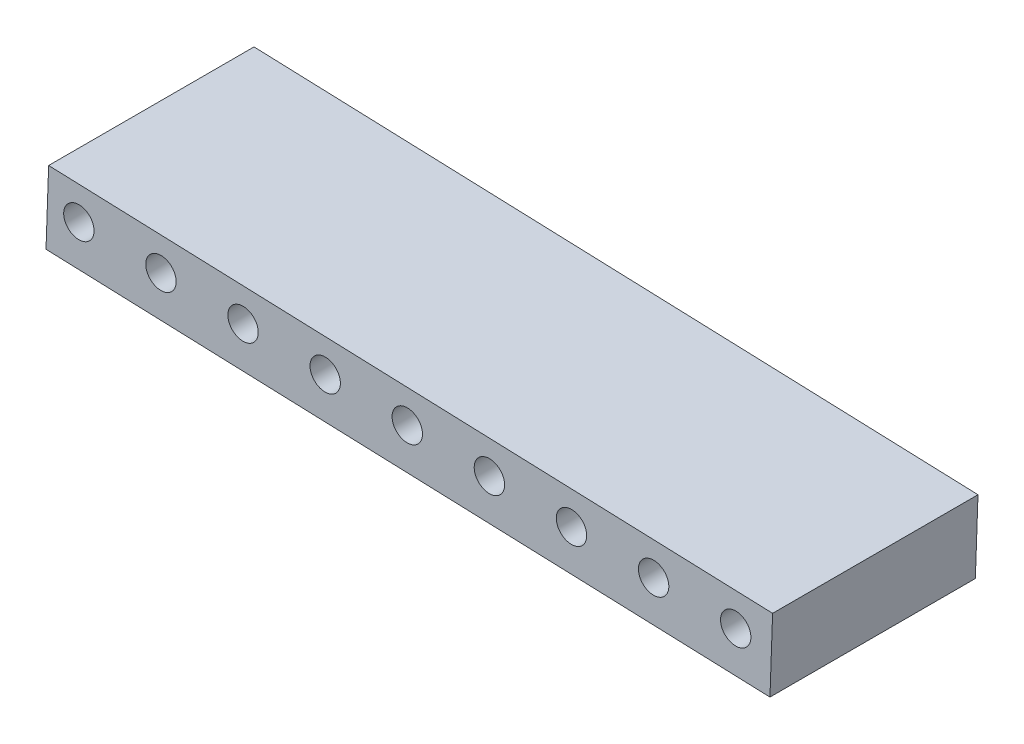
ISO-10303-21;
HEADER;
FILE_DESCRIPTION(('STEP AP214'),'2;1');
FILE_NAME('part.step','',(''),(''),'','','');
FILE_SCHEMA(('AUTOMOTIVE_DESIGN { 1 0 10303 214 1 1 1 1 }'));
ENDSEC;
DATA;
#1=APPLICATION_CONTEXT('core data for automotive mechanical design processes');
#2=APPLICATION_PROTOCOL_DEFINITION('international standard','automotive_design',2000,#1);
#3=PRODUCT_CONTEXT('',#1,'mechanical');
#4=PRODUCT('Part','Part','',(#3));
#5=PRODUCT_RELATED_PRODUCT_CATEGORY('part','',(#4));
#6=PRODUCT_DEFINITION_FORMATION('','',#4);
#7=PRODUCT_DEFINITION_CONTEXT('part definition',#1,'design');
#8=PRODUCT_DEFINITION('design','',#6,#7);
#9=PRODUCT_DEFINITION_SHAPE('','',#8);
#10=(LENGTH_UNIT() NAMED_UNIT(*) SI_UNIT(.MILLI.,.METRE.));
#11=(NAMED_UNIT(*) PLANE_ANGLE_UNIT() SI_UNIT($,.RADIAN.));
#12=(NAMED_UNIT(*) SI_UNIT($,.STERADIAN.) SOLID_ANGLE_UNIT());
#13=UNCERTAINTY_MEASURE_WITH_UNIT(LENGTH_MEASURE(1.E-05),#10,'distance_accuracy_value','');
#14=(GEOMETRIC_REPRESENTATION_CONTEXT(3) GLOBAL_UNCERTAINTY_ASSIGNED_CONTEXT((#13)) GLOBAL_UNIT_ASSIGNED_CONTEXT((#10,
#11,#12)) REPRESENTATION_CONTEXT('',''));
#15=CARTESIAN_POINT('',(0.,0.,0.));
#16=DIRECTION('',(0.,0.,1.));
#17=DIRECTION('',(1.,0.,0.));
#18=AXIS2_PLACEMENT_3D('',#15,#16,#17);
#19=CARTESIAN_POINT('',(-0.713375796178345,-19.9745222929936,-5.));
#20=DIRECTION('',(0.0356915305124125,0.99936285434755,0.));
#21=DIRECTION('',(-0.99936285434755,0.0356915305124125,0.));
#22=AXIS2_PLACEMENT_3D('',#19,#20,#21);
#23=PLANE('',#22);
#24=DIRECTION('',(0.,0.,-1.));
#25=VECTOR('',#24,1.);
#26=CARTESIAN_POINT('',(25.9812829781882,-20.9279029635067,5.));
#27=LINE('',#26,#25);
#28=CARTESIAN_POINT('',(25.9812829781882,-20.9279029635067,5.));
#29=VERTEX_POINT('',#28);
#30=CARTESIAN_POINT('',(25.9812829781882,-20.9279029635067,-20.));
#31=VERTEX_POINT('',#30);
#32=EDGE_CURVE('E154',#29,#31,#27,.T.);
#33=ORIENTED_EDGE('',*,*,#32,.T.);
#34=DIRECTION('',(-0.99936285434755,0.0356915305124126,0.));
#35=VECTOR('',#34,1.);
#36=CARTESIAN_POINT('',(134.085070339558,-24.7887525121271,-20.));
#37=LINE('',#36,#35);
#38=CARTESIAN_POINT('',(114.097813252607,-24.0749219018788,-20.));
#39=VERTEX_POINT('',#38);
#40=EDGE_CURVE('E170',#39,#31,#37,.T.);
#41=ORIENTED_EDGE('',*,*,#40,.F.);
#42=DIRECTION('',(0.,0.,1.));
#43=VECTOR('',#42,1.);
#44=CARTESIAN_POINT('',(114.097813252607,-24.0749219018789,-20.));
#45=LINE('',#44,#43);
#46=CARTESIAN_POINT('',(114.097813252607,-24.0749219018789,5.));
#47=VERTEX_POINT('',#46);
#48=EDGE_CURVE('E137',#39,#47,#45,.T.);
#49=ORIENTED_EDGE('',*,*,#48,.T.);
#50=DIRECTION('',(-0.99936285434755,0.0356915305124125,0.));
#51=VECTOR('',#50,1.);
#52=CARTESIAN_POINT('',(-0.713375796178345,-19.9745222929936,5.));
#53=LINE('',#52,#51);
#54=EDGE_CURVE('E122',#47,#29,#53,.T.);
#55=ORIENTED_EDGE('',*,*,#54,.T.);
#56=EDGE_LOOP('',(#33,#41,#49,#55));
#57=FACE_BOUND('',#56,.T.);
#58=ADVANCED_FACE('F114',(#57),#23,.F.);
#59=CARTESIAN_POINT('',(0.,0.,5.));
#60=DIRECTION('',(0.,0.,1.));
#61=DIRECTION('',(1.,0.,0.));
#62=AXIS2_PLACEMENT_3D('',#59,#60,#61);
#63=PLANE('',#62);
#64=CARTESIAN_POINT('',(29.9808856304264,-16.0707459153724,5.));
#65=DIRECTION('',(0.,0.,-1.));
#66=DIRECTION('',(-1.,0.,0.));
#67=AXIS2_PLACEMENT_3D('',#64,#65,#66);
#68=CIRCLE('',#67,1.85);
#69=CARTESIAN_POINT('',(28.1308856304264,-16.0707459153724,5.));
#70=VERTEX_POINT('',#69);
#71=EDGE_CURVE('E175',#70,#70,#68,.T.);
#72=ORIENTED_EDGE('',*,*,#71,.T.);
#73=EDGE_LOOP('',(#72));
#74=FACE_BOUND('',#73,.T.);
#75=CARTESIAN_POINT('',(39.9745141739019,-16.4276612204965,5.));
#76=DIRECTION('',(0.,0.,-1.));
#77=DIRECTION('',(-1.,0.,0.));
#78=AXIS2_PLACEMENT_3D('',#75,#76,#77);
#79=CIRCLE('',#78,1.85);
#80=CARTESIAN_POINT('',(38.1245141739019,-16.4276612204965,5.));
#81=VERTEX_POINT('',#80);
#82=EDGE_CURVE('E182',#81,#81,#79,.T.);
#83=ORIENTED_EDGE('',*,*,#82,.T.);
#84=EDGE_LOOP('',(#83));
#85=FACE_BOUND('',#84,.T.);
#86=CARTESIAN_POINT('',(49.9681427173774,-16.7845765256206,5.));
#87=DIRECTION('',(0.,0.,-1.));
#88=DIRECTION('',(-1.,0.,0.));
#89=AXIS2_PLACEMENT_3D('',#86,#87,#88);
#90=CIRCLE('',#89,1.85);
#91=CARTESIAN_POINT('',(48.1181427173774,-16.7845765256206,5.));
#92=VERTEX_POINT('',#91);
#93=EDGE_CURVE('E188',#92,#92,#90,.T.);
#94=ORIENTED_EDGE('',*,*,#93,.T.);
#95=EDGE_LOOP('',(#94));
#96=FACE_BOUND('',#95,.T.);
#97=CARTESIAN_POINT('',(59.9617712608529,-17.1414918307448,5.));
#98=DIRECTION('',(0.,0.,-1.));
#99=DIRECTION('',(-1.,0.,0.));
#100=AXIS2_PLACEMENT_3D('',#97,#98,#99);
#101=CIRCLE('',#100,1.85);
#102=CARTESIAN_POINT('',(58.1117712608529,-17.1414918307448,5.));
#103=VERTEX_POINT('',#102);
#104=EDGE_CURVE('E194',#103,#103,#101,.T.);
#105=ORIENTED_EDGE('',*,*,#104,.T.);
#106=EDGE_LOOP('',(#105));
#107=FACE_BOUND('',#106,.T.);
#108=CARTESIAN_POINT('',(69.9553998043284,-17.4984071358689,5.));
#109=DIRECTION('',(0.,0.,-1.));
#110=DIRECTION('',(-1.,0.,0.));
#111=AXIS2_PLACEMENT_3D('',#108,#109,#110);
#112=CIRCLE('',#111,1.85);
#113=CARTESIAN_POINT('',(68.1053998043284,-17.4984071358689,5.));
#114=VERTEX_POINT('',#113);
#115=EDGE_CURVE('E200',#114,#114,#112,.T.);
#116=ORIENTED_EDGE('',*,*,#115,.T.);
#117=EDGE_LOOP('',(#116));
#118=FACE_BOUND('',#117,.T.);
#119=CARTESIAN_POINT('',(79.9490283478039,-17.855322440993,5.));
#120=DIRECTION('',(0.,0.,-1.));
#121=DIRECTION('',(-1.,0.,0.));
#122=AXIS2_PLACEMENT_3D('',#119,#120,#121);
#123=CIRCLE('',#122,1.85);
#124=CARTESIAN_POINT('',(78.0990283478039,-17.855322440993,5.));
#125=VERTEX_POINT('',#124);
#126=EDGE_CURVE('E206',#125,#125,#123,.T.);
#127=ORIENTED_EDGE('',*,*,#126,.T.);
#128=EDGE_LOOP('',(#127));
#129=FACE_BOUND('',#128,.T.);
#130=CARTESIAN_POINT('',(89.9426568912794,-18.2122377461171,5.));
#131=DIRECTION('',(0.,0.,-1.));
#132=DIRECTION('',(-1.,0.,0.));
#133=AXIS2_PLACEMENT_3D('',#130,#131,#132);
#134=CIRCLE('',#133,1.85);
#135=CARTESIAN_POINT('',(88.0926568912793,-18.2122377461171,5.));
#136=VERTEX_POINT('',#135);
#137=EDGE_CURVE('E212',#136,#136,#134,.T.);
#138=ORIENTED_EDGE('',*,*,#137,.T.);
#139=EDGE_LOOP('',(#138));
#140=FACE_BOUND('',#139,.T.);
#141=CARTESIAN_POINT('',(99.9362854347548,-18.5691530512413,5.));
#142=DIRECTION('',(0.,0.,-1.));
#143=DIRECTION('',(-1.,0.,0.));
#144=AXIS2_PLACEMENT_3D('',#141,#142,#143);
#145=CIRCLE('',#144,1.85);
#146=CARTESIAN_POINT('',(98.0862854347548,-18.5691530512413,5.));
#147=VERTEX_POINT('',#146);
#148=EDGE_CURVE('E218',#147,#147,#145,.T.);
#149=ORIENTED_EDGE('',*,*,#148,.T.);
#150=EDGE_LOOP('',(#149));
#151=FACE_BOUND('',#150,.T.);
#152=CARTESIAN_POINT('',(109.92991397823,-18.9260683563654,5.));
#153=DIRECTION('',(0.,0.,-1.));
#154=DIRECTION('',(-1.,0.,0.));
#155=AXIS2_PLACEMENT_3D('',#152,#153,#154);
#156=CIRCLE('',#155,1.85);
#157=CARTESIAN_POINT('',(108.07991397823,-18.9260683563654,5.));
#158=VERTEX_POINT('',#157);
#159=EDGE_CURVE('E224',#158,#158,#156,.T.);
#160=ORIENTED_EDGE('',*,*,#159,.T.);
#161=EDGE_LOOP('',(#160));
#162=FACE_BOUND('',#161,.T.);
#163=DIRECTION('',(-0.99936285434755,0.0356915305124125,0.));
#164=VECTOR('',#163,1.);
#165=CARTESIAN_POINT('',(-0.392152021566632,-10.9802566038657,5.));
#166=LINE('',#165,#164);
#167=CARTESIAN_POINT('',(114.419037027218,-15.0806562127509,5.));
#168=VERTEX_POINT('',#167);
#169=CARTESIAN_POINT('',(26.3025067527999,-11.9336372743788,5.));
#170=VERTEX_POINT('',#169);
#171=EDGE_CURVE('E12',#168,#170,#166,.T.);
#172=ORIENTED_EDGE('',*,*,#171,.T.);
#173=DIRECTION('',(0.0356915305124142,0.99936285434755,0.));
#174=VECTOR('',#173,1.);
#175=CARTESIAN_POINT('',(26.6946587743666,-0.953380670513137,5.));
#176=LINE('',#175,#174);
#177=EDGE_CURVE('E157',#29,#170,#176,.T.);
#178=ORIENTED_EDGE('',*,*,#177,.F.);
#179=ORIENTED_EDGE('',*,*,#54,.F.);
#180=DIRECTION('',(-0.0356915305124099,-0.99936285434755,0.));
#181=VECTOR('',#180,1.);
#182=CARTESIAN_POINT('',(114.811189048785,-4.10039960888488,5.));
#183=LINE('',#182,#181);
#184=EDGE_CURVE('E179',#168,#47,#183,.T.);
#185=ORIENTED_EDGE('',*,*,#184,.F.);
#186=EDGE_LOOP('',(#172,#178,#179,#185));
#187=FACE_BOUND('',#186,.T.);
#188=ADVANCED_FACE('F116',(#74,#85,#96,#107,#118,#129,#140,#151,#162,#187),#63,.T.);
#189=CARTESIAN_POINT('',(-0.392152021566632,-10.9802566038657,0.));
#190=DIRECTION('',(0.0356915305124125,0.99936285434755,0.));
#191=DIRECTION('',(-0.99936285434755,0.0356915305124125,0.));
#192=AXIS2_PLACEMENT_3D('',#189,#190,#191);
#193=PLANE('',#192);
#194=DIRECTION('',(0.99936285434755,-0.0356915305124126,0.));
#195=VECTOR('',#194,1.);
#196=CARTESIAN_POINT('',(16.3088782093244,-11.5767219692547,-20.));
#197=LINE('',#196,#195);
#198=CARTESIAN_POINT('',(26.3025067527999,-11.9336372743788,-20.));
#199=VERTEX_POINT('',#198);
#200=CARTESIAN_POINT('',(114.419037027218,-15.0806562127509,-20.));
#201=VERTEX_POINT('',#200);
#202=EDGE_CURVE('E169',#199,#201,#197,.T.);
#203=ORIENTED_EDGE('',*,*,#202,.F.);
#204=DIRECTION('',(0.,0.,-1.));
#205=VECTOR('',#204,1.);
#206=CARTESIAN_POINT('',(26.3025067527999,-11.9336372743788,5.));
#207=LINE('',#206,#205);
#208=EDGE_CURVE('E129',#170,#199,#207,.T.);
#209=ORIENTED_EDGE('',*,*,#208,.F.);
#210=ORIENTED_EDGE('',*,*,#171,.F.);
#211=DIRECTION('',(0.,0.,1.));
#212=VECTOR('',#211,1.);
#213=CARTESIAN_POINT('',(114.419037027218,-15.0806562127509,-20.));
#214=LINE('',#213,#212);
#215=EDGE_CURVE('E230',#201,#168,#214,.T.);
#216=ORIENTED_EDGE('',*,*,#215,.F.);
#217=EDGE_LOOP('',(#203,#209,#210,#216));
#218=FACE_BOUND('',#217,.T.);
#219=ADVANCED_FACE('F241',(#218),#193,.T.);
#220=CARTESIAN_POINT('',(0.,0.,-20.));
#221=DIRECTION('',(0.,0.,-1.));
#222=DIRECTION('',(-1.,0.,0.));
#223=AXIS2_PLACEMENT_3D('',#220,#221,#222);
#224=PLANE('',#223);
#225=CARTESIAN_POINT('',(29.9808856304264,-16.0707459153724,-20.));
#226=DIRECTION('',(0.,0.,-1.));
#227=DIRECTION('',(-1.,0.,0.));
#228=AXIS2_PLACEMENT_3D('',#225,#226,#227);
#229=CIRCLE('',#228,1.85);
#230=CARTESIAN_POINT('',(28.1308856304264,-16.0707459153724,-20.));
#231=VERTEX_POINT('',#230);
#232=EDGE_CURVE('E178',#231,#231,#229,.T.);
#233=ORIENTED_EDGE('',*,*,#232,.F.);
#234=EDGE_LOOP('',(#233));
#235=FACE_BOUND('',#234,.T.);
#236=CARTESIAN_POINT('',(39.9745141739019,-16.4276612204965,-20.));
#237=DIRECTION('',(0.,0.,-1.));
#238=DIRECTION('',(-1.,0.,0.));
#239=AXIS2_PLACEMENT_3D('',#236,#237,#238);
#240=CIRCLE('',#239,1.85);
#241=CARTESIAN_POINT('',(38.1245141739019,-16.4276612204965,-20.));
#242=VERTEX_POINT('',#241);
#243=EDGE_CURVE('E185',#242,#242,#240,.T.);
#244=ORIENTED_EDGE('',*,*,#243,.F.);
#245=EDGE_LOOP('',(#244));
#246=FACE_BOUND('',#245,.T.);
#247=CARTESIAN_POINT('',(49.9681427173774,-16.7845765256206,-20.));
#248=DIRECTION('',(0.,0.,-1.));
#249=DIRECTION('',(-1.,0.,0.));
#250=AXIS2_PLACEMENT_3D('',#247,#248,#249);
#251=CIRCLE('',#250,1.85);
#252=CARTESIAN_POINT('',(48.1181427173774,-16.7845765256206,-20.));
#253=VERTEX_POINT('',#252);
#254=EDGE_CURVE('E191',#253,#253,#251,.T.);
#255=ORIENTED_EDGE('',*,*,#254,.F.);
#256=EDGE_LOOP('',(#255));
#257=FACE_BOUND('',#256,.T.);
#258=CARTESIAN_POINT('',(59.9617712608529,-17.1414918307448,-20.));
#259=DIRECTION('',(0.,0.,-1.));
#260=DIRECTION('',(-1.,0.,0.));
#261=AXIS2_PLACEMENT_3D('',#258,#259,#260);
#262=CIRCLE('',#261,1.85);
#263=CARTESIAN_POINT('',(58.1117712608529,-17.1414918307448,-20.));
#264=VERTEX_POINT('',#263);
#265=EDGE_CURVE('E197',#264,#264,#262,.T.);
#266=ORIENTED_EDGE('',*,*,#265,.F.);
#267=EDGE_LOOP('',(#266));
#268=FACE_BOUND('',#267,.T.);
#269=CARTESIAN_POINT('',(69.9553998043284,-17.4984071358689,-20.));
#270=DIRECTION('',(0.,0.,-1.));
#271=DIRECTION('',(-1.,0.,0.));
#272=AXIS2_PLACEMENT_3D('',#269,#270,#271);
#273=CIRCLE('',#272,1.85);
#274=CARTESIAN_POINT('',(68.1053998043284,-17.4984071358689,-20.));
#275=VERTEX_POINT('',#274);
#276=EDGE_CURVE('E203',#275,#275,#273,.T.);
#277=ORIENTED_EDGE('',*,*,#276,.F.);
#278=EDGE_LOOP('',(#277));
#279=FACE_BOUND('',#278,.T.);
#280=CARTESIAN_POINT('',(79.9490283478039,-17.855322440993,-20.));
#281=DIRECTION('',(0.,0.,-1.));
#282=DIRECTION('',(-1.,0.,0.));
#283=AXIS2_PLACEMENT_3D('',#280,#281,#282);
#284=CIRCLE('',#283,1.85);
#285=CARTESIAN_POINT('',(78.0990283478039,-17.855322440993,-20.));
#286=VERTEX_POINT('',#285);
#287=EDGE_CURVE('E209',#286,#286,#284,.T.);
#288=ORIENTED_EDGE('',*,*,#287,.F.);
#289=EDGE_LOOP('',(#288));
#290=FACE_BOUND('',#289,.T.);
#291=CARTESIAN_POINT('',(89.9426568912794,-18.2122377461171,-20.));
#292=DIRECTION('',(0.,0.,-1.));
#293=DIRECTION('',(-1.,0.,0.));
#294=AXIS2_PLACEMENT_3D('',#291,#292,#293);
#295=CIRCLE('',#294,1.85);
#296=CARTESIAN_POINT('',(88.0926568912793,-18.2122377461171,-20.));
#297=VERTEX_POINT('',#296);
#298=EDGE_CURVE('E215',#297,#297,#295,.T.);
#299=ORIENTED_EDGE('',*,*,#298,.F.);
#300=EDGE_LOOP('',(#299));
#301=FACE_BOUND('',#300,.T.);
#302=CARTESIAN_POINT('',(99.9362854347548,-18.5691530512413,-20.));
#303=DIRECTION('',(0.,0.,-1.));
#304=DIRECTION('',(-1.,0.,0.));
#305=AXIS2_PLACEMENT_3D('',#302,#303,#304);
#306=CIRCLE('',#305,1.85);
#307=CARTESIAN_POINT('',(98.0862854347548,-18.5691530512413,-20.));
#308=VERTEX_POINT('',#307);
#309=EDGE_CURVE('E221',#308,#308,#306,.T.);
#310=ORIENTED_EDGE('',*,*,#309,.F.);
#311=EDGE_LOOP('',(#310));
#312=FACE_BOUND('',#311,.T.);
#313=CARTESIAN_POINT('',(109.92991397823,-18.9260683563654,-20.));
#314=DIRECTION('',(0.,0.,-1.));
#315=DIRECTION('',(-1.,0.,0.));
#316=AXIS2_PLACEMENT_3D('',#313,#314,#315);
#317=CIRCLE('',#316,1.85);
#318=CARTESIAN_POINT('',(108.07991397823,-18.9260683563654,-20.));
#319=VERTEX_POINT('',#318);
#320=EDGE_CURVE('E174',#319,#319,#317,.T.);
#321=ORIENTED_EDGE('',*,*,#320,.F.);
#322=EDGE_LOOP('',(#321));
#323=FACE_BOUND('',#322,.T.);
#324=ORIENTED_EDGE('',*,*,#40,.T.);
#325=DIRECTION('',(0.0356915305124142,0.99936285434755,0.));
#326=VECTOR('',#325,1.);
#327=CARTESIAN_POINT('',(26.6946587743666,-0.953380670513137,-20.));
#328=LINE('',#327,#326);
#329=EDGE_CURVE('E158',#31,#199,#328,.T.);
#330=ORIENTED_EDGE('',*,*,#329,.T.);
#331=ORIENTED_EDGE('',*,*,#202,.T.);
#332=DIRECTION('',(-0.0356915305124099,-0.99936285434755,0.));
#333=VECTOR('',#332,1.);
#334=CARTESIAN_POINT('',(114.419037027218,-15.0806562127509,-20.));
#335=LINE('',#334,#333);
#336=EDGE_CURVE('E232',#201,#39,#335,.T.);
#337=ORIENTED_EDGE('',*,*,#336,.T.);
#338=EDGE_LOOP('',(#324,#330,#331,#337));
#339=FACE_BOUND('',#338,.T.);
#340=ADVANCED_FACE('F238',(#235,#246,#257,#268,#279,#290,#301,#312,#323,#339),#224,.T.);
#341=CARTESIAN_POINT('',(29.9808856304264,-16.0707459153724,5.));
#342=DIRECTION('',(0.,0.,-1.));
#343=DIRECTION('',(-1.,0.,0.));
#344=AXIS2_PLACEMENT_3D('',#341,#342,#343);
#345=CYLINDRICAL_SURFACE('',#344,1.85);
#346=ORIENTED_EDGE('',*,*,#71,.F.);
#347=EDGE_LOOP('',(#346));
#348=FACE_BOUND('',#347,.T.);
#349=ORIENTED_EDGE('',*,*,#232,.T.);
#350=EDGE_LOOP('',(#349));
#351=FACE_BOUND('',#350,.T.);
#352=ADVANCED_FACE('F266',(#348,#351),#345,.F.);
#353=CARTESIAN_POINT('',(39.9745141739019,-16.4276612204965,5.));
#354=DIRECTION('',(0.,0.,-1.));
#355=DIRECTION('',(-1.,0.,0.));
#356=AXIS2_PLACEMENT_3D('',#353,#354,#355);
#357=CYLINDRICAL_SURFACE('',#356,1.85);
#358=ORIENTED_EDGE('',*,*,#82,.F.);
#359=EDGE_LOOP('',(#358));
#360=FACE_BOUND('',#359,.T.);
#361=ORIENTED_EDGE('',*,*,#243,.T.);
#362=EDGE_LOOP('',(#361));
#363=FACE_BOUND('',#362,.T.);
#364=ADVANCED_FACE('F271',(#360,#363),#357,.F.);
#365=CARTESIAN_POINT('',(49.9681427173774,-16.7845765256206,5.));
#366=DIRECTION('',(0.,0.,-1.));
#367=DIRECTION('',(-1.,0.,0.));
#368=AXIS2_PLACEMENT_3D('',#365,#366,#367);
#369=CYLINDRICAL_SURFACE('',#368,1.85);
#370=ORIENTED_EDGE('',*,*,#93,.F.);
#371=EDGE_LOOP('',(#370));
#372=FACE_BOUND('',#371,.T.);
#373=ORIENTED_EDGE('',*,*,#254,.T.);
#374=EDGE_LOOP('',(#373));
#375=FACE_BOUND('',#374,.T.);
#376=ADVANCED_FACE('F314',(#372,#375),#369,.F.);
#377=CARTESIAN_POINT('',(59.9617712608529,-17.1414918307448,5.));
#378=DIRECTION('',(0.,0.,-1.));
#379=DIRECTION('',(-1.,0.,0.));
#380=AXIS2_PLACEMENT_3D('',#377,#378,#379);
#381=CYLINDRICAL_SURFACE('',#380,1.85);
#382=ORIENTED_EDGE('',*,*,#104,.F.);
#383=EDGE_LOOP('',(#382));
#384=FACE_BOUND('',#383,.T.);
#385=ORIENTED_EDGE('',*,*,#265,.T.);
#386=EDGE_LOOP('',(#385));
#387=FACE_BOUND('',#386,.T.);
#388=ADVANCED_FACE('F310',(#384,#387),#381,.F.);
#389=CARTESIAN_POINT('',(69.9553998043284,-17.4984071358689,5.));
#390=DIRECTION('',(0.,0.,-1.));
#391=DIRECTION('',(-1.,0.,0.));
#392=AXIS2_PLACEMENT_3D('',#389,#390,#391);
#393=CYLINDRICAL_SURFACE('',#392,1.85);
#394=ORIENTED_EDGE('',*,*,#115,.F.);
#395=EDGE_LOOP('',(#394));
#396=FACE_BOUND('',#395,.T.);
#397=ORIENTED_EDGE('',*,*,#276,.T.);
#398=EDGE_LOOP('',(#397));
#399=FACE_BOUND('',#398,.T.);
#400=ADVANCED_FACE('F306',(#396,#399),#393,.F.);
#401=CARTESIAN_POINT('',(79.9490283478039,-17.855322440993,5.));
#402=DIRECTION('',(0.,0.,-1.));
#403=DIRECTION('',(-1.,0.,0.));
#404=AXIS2_PLACEMENT_3D('',#401,#402,#403);
#405=CYLINDRICAL_SURFACE('',#404,1.85);
#406=ORIENTED_EDGE('',*,*,#126,.F.);
#407=EDGE_LOOP('',(#406));
#408=FACE_BOUND('',#407,.T.);
#409=ORIENTED_EDGE('',*,*,#287,.T.);
#410=EDGE_LOOP('',(#409));
#411=FACE_BOUND('',#410,.T.);
#412=ADVANCED_FACE('F299',(#408,#411),#405,.F.);
#413=CARTESIAN_POINT('',(89.9426568912794,-18.2122377461171,5.));
#414=DIRECTION('',(0.,0.,-1.));
#415=DIRECTION('',(-1.,0.,0.));
#416=AXIS2_PLACEMENT_3D('',#413,#414,#415);
#417=CYLINDRICAL_SURFACE('',#416,1.85);
#418=ORIENTED_EDGE('',*,*,#137,.F.);
#419=EDGE_LOOP('',(#418));
#420=FACE_BOUND('',#419,.T.);
#421=ORIENTED_EDGE('',*,*,#298,.T.);
#422=EDGE_LOOP('',(#421));
#423=FACE_BOUND('',#422,.T.);
#424=ADVANCED_FACE('F293',(#420,#423),#417,.F.);
#425=CARTESIAN_POINT('',(99.9362854347548,-18.5691530512413,5.));
#426=DIRECTION('',(0.,0.,-1.));
#427=DIRECTION('',(-1.,0.,0.));
#428=AXIS2_PLACEMENT_3D('',#425,#426,#427);
#429=CYLINDRICAL_SURFACE('',#428,1.85);
#430=ORIENTED_EDGE('',*,*,#148,.F.);
#431=EDGE_LOOP('',(#430));
#432=FACE_BOUND('',#431,.T.);
#433=ORIENTED_EDGE('',*,*,#309,.T.);
#434=EDGE_LOOP('',(#433));
#435=FACE_BOUND('',#434,.T.);
#436=ADVANCED_FACE('F252',(#432,#435),#429,.F.);
#437=CARTESIAN_POINT('',(109.92991397823,-18.9260683563654,5.));
#438=DIRECTION('',(0.,0.,-1.));
#439=DIRECTION('',(-1.,0.,0.));
#440=AXIS2_PLACEMENT_3D('',#437,#438,#439);
#441=CYLINDRICAL_SURFACE('',#440,1.85);
#442=ORIENTED_EDGE('',*,*,#159,.F.);
#443=EDGE_LOOP('',(#442));
#444=FACE_BOUND('',#443,.T.);
#445=ORIENTED_EDGE('',*,*,#320,.T.);
#446=EDGE_LOOP('',(#445));
#447=FACE_BOUND('',#446,.T.);
#448=ADVANCED_FACE('F244',(#444,#447),#441,.F.);
#449=CARTESIAN_POINT('',(114.419037027218,-15.0806562127509,-20.));
#450=DIRECTION('',(-0.99936285434755,0.0356915305124099,0.));
#451=DIRECTION('',(-0.0356915305124099,-0.99936285434755,0.));
#452=AXIS2_PLACEMENT_3D('',#449,#450,#451);
#453=PLANE('',#452);
#454=ORIENTED_EDGE('',*,*,#184,.T.);
#455=ORIENTED_EDGE('',*,*,#48,.F.);
#456=ORIENTED_EDGE('',*,*,#336,.F.);
#457=ORIENTED_EDGE('',*,*,#215,.T.);
#458=EDGE_LOOP('',(#454,#455,#456,#457));
#459=FACE_BOUND('',#458,.T.);
#460=ADVANCED_FACE('F242',(#459),#453,.F.);
#461=CARTESIAN_POINT('',(26.6946587743666,-0.953380670513137,5.));
#462=DIRECTION('',(-0.999362854347549,0.0356915305124142,0.));
#463=DIRECTION('',(-0.0356915305124142,-0.99936285434755,0.));
#464=AXIS2_PLACEMENT_3D('',#461,#462,#463);
#465=PLANE('',#464);
#466=ORIENTED_EDGE('',*,*,#329,.F.);
#467=ORIENTED_EDGE('',*,*,#32,.F.);
#468=ORIENTED_EDGE('',*,*,#177,.T.);
#469=ORIENTED_EDGE('',*,*,#208,.T.);
#470=EDGE_LOOP('',(#466,#467,#468,#469));
#471=FACE_BOUND('',#470,.T.);
#472=ADVANCED_FACE('F156',(#471),#465,.T.);
#473=CLOSED_SHELL('',(#58,#188,#219,#340,#352,#364,#376,#388,#400,#412,#424,#436,#448,#460,#472));
#474=MANIFOLD_SOLID_BREP('B2',#473);
#475=ADVANCED_BREP_SHAPE_REPRESENTATION('',(#18,#474),#14);
#476=SHAPE_DEFINITION_REPRESENTATION(#9,#475);
ENDSEC;
END-ISO-10303-21;
